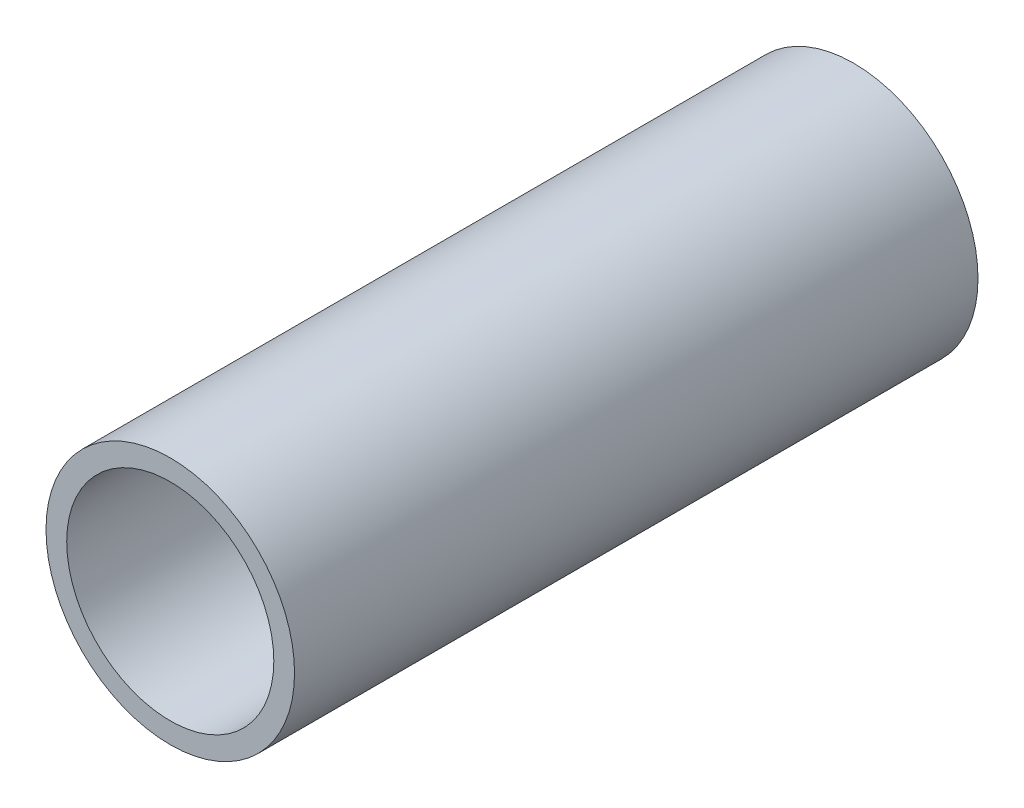
ISO-10303-21;
HEADER;
FILE_DESCRIPTION(('STEP AP214'),'2;1');
FILE_NAME('part.step','',(''),(''),'','','');
FILE_SCHEMA(('AUTOMOTIVE_DESIGN { 1 0 10303 214 1 1 1 1 }'));
ENDSEC;
DATA;
#1=APPLICATION_CONTEXT('core data for automotive mechanical design processes');
#2=APPLICATION_PROTOCOL_DEFINITION('international standard','automotive_design',2000,#1);
#3=PRODUCT_CONTEXT('',#1,'mechanical');
#4=PRODUCT('Part','Part','',(#3));
#5=PRODUCT_RELATED_PRODUCT_CATEGORY('part','',(#4));
#6=PRODUCT_DEFINITION_FORMATION('','',#4);
#7=PRODUCT_DEFINITION_CONTEXT('part definition',#1,'design');
#8=PRODUCT_DEFINITION('design','',#6,#7);
#9=PRODUCT_DEFINITION_SHAPE('','',#8);
#10=(LENGTH_UNIT() NAMED_UNIT(*) SI_UNIT(.MILLI.,.METRE.));
#11=(NAMED_UNIT(*) PLANE_ANGLE_UNIT() SI_UNIT($,.RADIAN.));
#12=(NAMED_UNIT(*) SI_UNIT($,.STERADIAN.) SOLID_ANGLE_UNIT());
#13=UNCERTAINTY_MEASURE_WITH_UNIT(LENGTH_MEASURE(1.E-05),#10,'distance_accuracy_value','');
#14=(GEOMETRIC_REPRESENTATION_CONTEXT(3) GLOBAL_UNCERTAINTY_ASSIGNED_CONTEXT((#13)) GLOBAL_UNIT_ASSIGNED_CONTEXT((#10,
#11,#12)) REPRESENTATION_CONTEXT('',''));
#15=CARTESIAN_POINT('',(0.,0.,0.));
#16=DIRECTION('',(0.,0.,1.));
#17=DIRECTION('',(1.,0.,0.));
#18=AXIS2_PLACEMENT_3D('',#15,#16,#17);
#19=CARTESIAN_POINT('',(0.,0.,33.));
#20=DIRECTION('',(0.,0.,1.));
#21=DIRECTION('',(1.,0.,0.));
#22=AXIS2_PLACEMENT_3D('',#19,#20,#21);
#23=PLANE('',#22);
#24=CARTESIAN_POINT('',(0.,0.,33.));
#25=DIRECTION('',(0.,0.,1.));
#26=DIRECTION('',(1.,0.,0.));
#27=AXIS2_PLACEMENT_3D('',#24,#25,#26);
#28=CIRCLE('',#27,6.);
#29=CARTESIAN_POINT('',(6.,0.,33.));
#30=VERTEX_POINT('',#29);
#31=EDGE_CURVE('E10',#30,#30,#28,.T.);
#32=ORIENTED_EDGE('',*,*,#31,.T.);
#33=EDGE_LOOP('',(#32));
#34=FACE_BOUND('',#33,.T.);
#35=CARTESIAN_POINT('',(0.,0.,33.));
#36=DIRECTION('',(0.,0.,1.));
#37=DIRECTION('',(1.,0.,0.));
#38=AXIS2_PLACEMENT_3D('',#35,#36,#37);
#39=CIRCLE('',#38,5.);
#40=CARTESIAN_POINT('',(5.,0.,33.));
#41=VERTEX_POINT('',#40);
#42=EDGE_CURVE('E42',#41,#41,#39,.T.);
#43=ORIENTED_EDGE('',*,*,#42,.F.);
#44=EDGE_LOOP('',(#43));
#45=FACE_BOUND('',#44,.T.);
#46=ADVANCED_FACE('F31',(#34,#45),#23,.T.);
#47=CARTESIAN_POINT('',(0.,0.,0.));
#48=DIRECTION('',(0.,0.,1.));
#49=DIRECTION('',(1.,0.,0.));
#50=AXIS2_PLACEMENT_3D('',#47,#48,#49);
#51=PLANE('',#50);
#52=CARTESIAN_POINT('',(0.,0.,0.));
#53=DIRECTION('',(0.,0.,1.));
#54=DIRECTION('',(1.,0.,0.));
#55=AXIS2_PLACEMENT_3D('',#52,#53,#54);
#56=CIRCLE('',#55,6.);
#57=CARTESIAN_POINT('',(6.,0.,0.));
#58=VERTEX_POINT('',#57);
#59=EDGE_CURVE('E35',#58,#58,#56,.T.);
#60=ORIENTED_EDGE('',*,*,#59,.F.);
#61=EDGE_LOOP('',(#60));
#62=FACE_BOUND('',#61,.T.);
#63=CARTESIAN_POINT('',(0.,0.,0.));
#64=DIRECTION('',(0.,0.,1.));
#65=DIRECTION('',(1.,0.,0.));
#66=AXIS2_PLACEMENT_3D('',#63,#64,#65);
#67=CIRCLE('',#66,5.);
#68=CARTESIAN_POINT('',(5.,0.,0.));
#69=VERTEX_POINT('',#68);
#70=EDGE_CURVE('E44',#69,#69,#67,.T.);
#71=ORIENTED_EDGE('',*,*,#70,.T.);
#72=EDGE_LOOP('',(#71));
#73=FACE_BOUND('',#72,.T.);
#74=ADVANCED_FACE('F54',(#62,#73),#51,.F.);
#75=CARTESIAN_POINT('',(0.,0.,33.));
#76=DIRECTION('',(0.,0.,-1.));
#77=DIRECTION('',(-1.,0.,0.));
#78=AXIS2_PLACEMENT_3D('',#75,#76,#77);
#79=CYLINDRICAL_SURFACE('',#78,6.);
#80=ORIENTED_EDGE('',*,*,#31,.F.);
#81=EDGE_LOOP('',(#80));
#82=FACE_BOUND('',#81,.T.);
#83=ORIENTED_EDGE('',*,*,#59,.T.);
#84=EDGE_LOOP('',(#83));
#85=FACE_BOUND('',#84,.T.);
#86=ADVANCED_FACE('F33',(#82,#85),#79,.T.);
#87=CARTESIAN_POINT('',(0.,0.,33.));
#88=DIRECTION('',(0.,0.,-1.));
#89=DIRECTION('',(-1.,0.,0.));
#90=AXIS2_PLACEMENT_3D('',#87,#88,#89);
#91=CYLINDRICAL_SURFACE('',#90,5.);
#92=ORIENTED_EDGE('',*,*,#42,.T.);
#93=EDGE_LOOP('',(#92));
#94=FACE_BOUND('',#93,.T.);
#95=ORIENTED_EDGE('',*,*,#70,.F.);
#96=EDGE_LOOP('',(#95));
#97=FACE_BOUND('',#96,.T.);
#98=ADVANCED_FACE('F50',(#94,#97),#91,.F.);
#99=CLOSED_SHELL('',(#46,#74,#86,#98));
#100=MANIFOLD_SOLID_BREP('B2',#99);
#101=ADVANCED_BREP_SHAPE_REPRESENTATION('',(#18,#100),#14);
#102=SHAPE_DEFINITION_REPRESENTATION(#9,#101);
ENDSEC;
END-ISO-10303-21;
